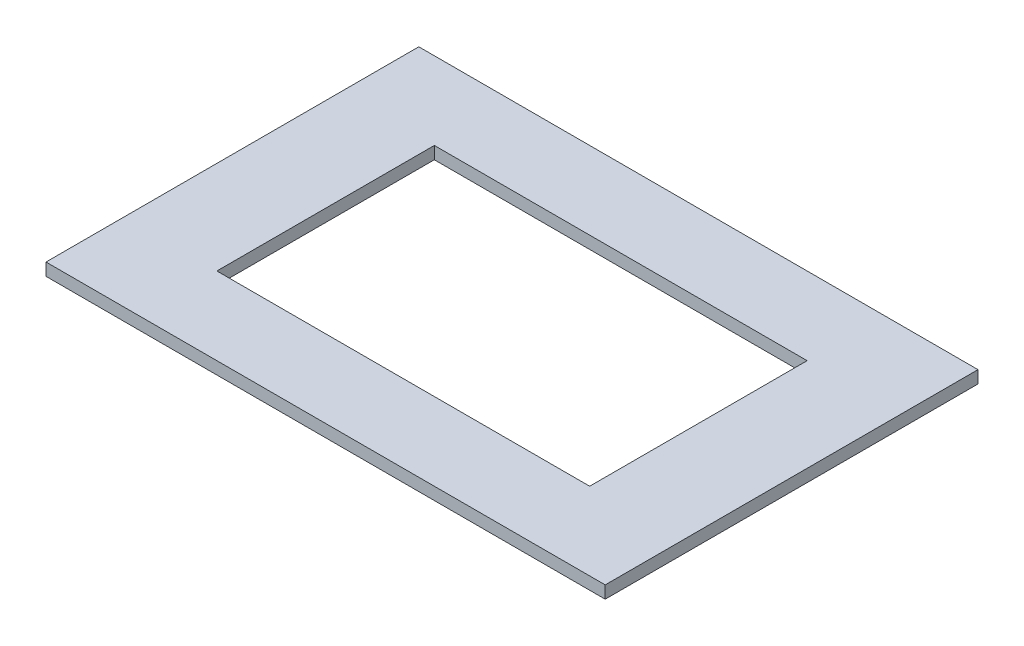
ISO-10303-21;
HEADER;
FILE_DESCRIPTION(('STEP AP214'),'2;1');
FILE_NAME('part.step','',(''),(''),'','','');
FILE_SCHEMA(('AUTOMOTIVE_DESIGN { 1 0 10303 214 1 1 1 1 }'));
ENDSEC;
DATA;
#1=APPLICATION_CONTEXT('core data for automotive mechanical design processes');
#2=APPLICATION_PROTOCOL_DEFINITION('international standard','automotive_design',2000,#1);
#3=PRODUCT_CONTEXT('',#1,'mechanical');
#4=PRODUCT('Part','Part','',(#3));
#5=PRODUCT_RELATED_PRODUCT_CATEGORY('part','',(#4));
#6=PRODUCT_DEFINITION_FORMATION('','',#4);
#7=PRODUCT_DEFINITION_CONTEXT('part definition',#1,'design');
#8=PRODUCT_DEFINITION('design','',#6,#7);
#9=PRODUCT_DEFINITION_SHAPE('','',#8);
#10=(LENGTH_UNIT() NAMED_UNIT(*) SI_UNIT(.MILLI.,.METRE.));
#11=(NAMED_UNIT(*) PLANE_ANGLE_UNIT() SI_UNIT($,.RADIAN.));
#12=(NAMED_UNIT(*) SI_UNIT($,.STERADIAN.) SOLID_ANGLE_UNIT());
#13=UNCERTAINTY_MEASURE_WITH_UNIT(LENGTH_MEASURE(1.E-05),#10,'distance_accuracy_value','');
#14=(GEOMETRIC_REPRESENTATION_CONTEXT(3) GLOBAL_UNCERTAINTY_ASSIGNED_CONTEXT((#13)) GLOBAL_UNIT_ASSIGNED_CONTEXT((#10,
#11,#12)) REPRESENTATION_CONTEXT('',''));
#15=CARTESIAN_POINT('',(0.,0.,0.));
#16=DIRECTION('',(0.,0.,1.));
#17=DIRECTION('',(1.,0.,0.));
#18=AXIS2_PLACEMENT_3D('',#15,#16,#17);
#19=CARTESIAN_POINT('',(0.,6.,0.));
#20=DIRECTION('',(0.,-1.,0.));
#21=DIRECTION('',(0.,0.,-1.));
#22=AXIS2_PLACEMENT_3D('',#19,#20,#21);
#23=PLANE('',#22);
#24=DIRECTION('',(1.,0.,0.));
#25=VECTOR('',#24,1.);
#26=CARTESIAN_POINT('',(270.,6.,0.));
#27=LINE('',#26,#25);
#28=CARTESIAN_POINT('',(0.,6.,0.));
#29=VERTEX_POINT('',#28);
#30=CARTESIAN_POINT('',(270.,6.,0.));
#31=VERTEX_POINT('',#30);
#32=EDGE_CURVE('E134',#29,#31,#27,.T.);
#33=ORIENTED_EDGE('',*,*,#32,.T.);
#34=DIRECTION('',(0.,0.,-1.));
#35=VECTOR('',#34,1.);
#36=CARTESIAN_POINT('',(270.,6.,-180.));
#37=LINE('',#36,#35);
#38=CARTESIAN_POINT('',(270.,6.,-180.));
#39=VERTEX_POINT('',#38);
#40=EDGE_CURVE('E137',#31,#39,#37,.T.);
#41=ORIENTED_EDGE('',*,*,#40,.T.);
#42=DIRECTION('',(-1.,0.,0.));
#43=VECTOR('',#42,1.);
#44=CARTESIAN_POINT('',(0.,6.,-180.));
#45=LINE('',#44,#43);
#46=CARTESIAN_POINT('',(0.,6.,-180.));
#47=VERTEX_POINT('',#46);
#48=EDGE_CURVE('E140',#39,#47,#45,.T.);
#49=ORIENTED_EDGE('',*,*,#48,.T.);
#50=DIRECTION('',(0.,0.,1.));
#51=VECTOR('',#50,1.);
#52=CARTESIAN_POINT('',(0.,6.,0.));
#53=LINE('',#52,#51);
#54=EDGE_CURVE('E142',#47,#29,#53,.T.);
#55=ORIENTED_EDGE('',*,*,#54,.T.);
#56=EDGE_LOOP('',(#33,#41,#49,#55));
#57=FACE_BOUND('',#56,.T.);
#58=DIRECTION('',(-1.,0.,0.));
#59=VECTOR('',#58,1.);
#60=CARTESIAN_POINT('',(225.,6.,-142.5));
#61=LINE('',#60,#59);
#62=CARTESIAN_POINT('',(225.,6.,-142.5));
#63=VERTEX_POINT('',#62);
#64=CARTESIAN_POINT('',(45.0000000000001,6.,-142.5));
#65=VERTEX_POINT('',#64);
#66=EDGE_CURVE('E98',#63,#65,#61,.T.);
#67=ORIENTED_EDGE('',*,*,#66,.F.);
#68=DIRECTION('',(0.,0.,-1.));
#69=VECTOR('',#68,1.);
#70=CARTESIAN_POINT('',(225.,6.,-37.5));
#71=LINE('',#70,#69);
#72=CARTESIAN_POINT('',(225.,6.,-37.5));
#73=VERTEX_POINT('',#72);
#74=EDGE_CURVE('E120',#73,#63,#71,.T.);
#75=ORIENTED_EDGE('',*,*,#74,.F.);
#76=DIRECTION('',(1.,0.,0.));
#77=VECTOR('',#76,1.);
#78=CARTESIAN_POINT('',(45.0000000000001,6.,-37.5));
#79=LINE('',#78,#77);
#80=CARTESIAN_POINT('',(45.0000000000001,6.,-37.5));
#81=VERTEX_POINT('',#80);
#82=EDGE_CURVE('E118',#81,#73,#79,.T.);
#83=ORIENTED_EDGE('',*,*,#82,.F.);
#84=DIRECTION('',(0.,0.,1.));
#85=VECTOR('',#84,1.);
#86=CARTESIAN_POINT('',(45.0000000000001,6.,-142.5));
#87=LINE('',#86,#85);
#88=EDGE_CURVE('E106',#65,#81,#87,.T.);
#89=ORIENTED_EDGE('',*,*,#88,.F.);
#90=EDGE_LOOP('',(#67,#75,#83,#89));
#91=FACE_BOUND('',#90,.T.);
#92=ADVANCED_FACE('F33',(#57,#91),#23,.F.);
#93=CARTESIAN_POINT('',(0.,0.,0.));
#94=DIRECTION('',(0.,-1.,0.));
#95=DIRECTION('',(0.,0.,-1.));
#96=AXIS2_PLACEMENT_3D('',#93,#94,#95);
#97=PLANE('',#96);
#98=DIRECTION('',(1.,0.,0.));
#99=VECTOR('',#98,1.);
#100=CARTESIAN_POINT('',(270.,0.,0.));
#101=LINE('',#100,#99);
#102=CARTESIAN_POINT('',(0.,0.,0.));
#103=VERTEX_POINT('',#102);
#104=CARTESIAN_POINT('',(270.,0.,0.));
#105=VERTEX_POINT('',#104);
#106=EDGE_CURVE('E114',#103,#105,#101,.T.);
#107=ORIENTED_EDGE('',*,*,#106,.F.);
#108=DIRECTION('',(0.,0.,1.));
#109=VECTOR('',#108,1.);
#110=CARTESIAN_POINT('',(0.,0.,0.));
#111=LINE('',#110,#109);
#112=CARTESIAN_POINT('',(0.,0.,-180.));
#113=VERTEX_POINT('',#112);
#114=EDGE_CURVE('E138',#113,#103,#111,.T.);
#115=ORIENTED_EDGE('',*,*,#114,.F.);
#116=DIRECTION('',(-1.,0.,0.));
#117=VECTOR('',#116,1.);
#118=CARTESIAN_POINT('',(0.,0.,-180.));
#119=LINE('',#118,#117);
#120=CARTESIAN_POINT('',(270.,0.,-180.));
#121=VERTEX_POINT('',#120);
#122=EDGE_CURVE('E149',#121,#113,#119,.T.);
#123=ORIENTED_EDGE('',*,*,#122,.F.);
#124=DIRECTION('',(0.,0.,-1.));
#125=VECTOR('',#124,1.);
#126=CARTESIAN_POINT('',(270.,0.,-180.));
#127=LINE('',#126,#125);
#128=EDGE_CURVE('E147',#105,#121,#127,.T.);
#129=ORIENTED_EDGE('',*,*,#128,.F.);
#130=EDGE_LOOP('',(#107,#115,#123,#129));
#131=FACE_BOUND('',#130,.T.);
#132=DIRECTION('',(0.,0.,-1.));
#133=VECTOR('',#132,1.);
#134=CARTESIAN_POINT('',(225.,0.,-37.5));
#135=LINE('',#134,#133);
#136=CARTESIAN_POINT('',(225.,0.,-37.5));
#137=VERTEX_POINT('',#136);
#138=CARTESIAN_POINT('',(225.,0.,-142.5));
#139=VERTEX_POINT('',#138);
#140=EDGE_CURVE('E107',#137,#139,#135,.T.);
#141=ORIENTED_EDGE('',*,*,#140,.T.);
#142=DIRECTION('',(-1.,0.,0.));
#143=VECTOR('',#142,1.);
#144=CARTESIAN_POINT('',(225.,0.,-142.5));
#145=LINE('',#144,#143);
#146=CARTESIAN_POINT('',(45.0000000000001,0.,-142.5));
#147=VERTEX_POINT('',#146);
#148=EDGE_CURVE('E56',#139,#147,#145,.T.);
#149=ORIENTED_EDGE('',*,*,#148,.T.);
#150=DIRECTION('',(0.,0.,1.));
#151=VECTOR('',#150,1.);
#152=CARTESIAN_POINT('',(45.0000000000001,0.,-142.5));
#153=LINE('',#152,#151);
#154=CARTESIAN_POINT('',(45.0000000000001,0.,-37.5));
#155=VERTEX_POINT('',#154);
#156=EDGE_CURVE('E113',#147,#155,#153,.T.);
#157=ORIENTED_EDGE('',*,*,#156,.T.);
#158=DIRECTION('',(1.,0.,0.));
#159=VECTOR('',#158,1.);
#160=CARTESIAN_POINT('',(45.0000000000001,0.,-37.5));
#161=LINE('',#160,#159);
#162=EDGE_CURVE('E126',#155,#137,#161,.T.);
#163=ORIENTED_EDGE('',*,*,#162,.T.);
#164=EDGE_LOOP('',(#141,#149,#157,#163));
#165=FACE_BOUND('',#164,.T.);
#166=ADVANCED_FACE('F167',(#131,#165),#97,.T.);
#167=CARTESIAN_POINT('',(270.,6.,0.));
#168=DIRECTION('',(0.,0.,-1.));
#169=DIRECTION('',(-1.,0.,0.));
#170=AXIS2_PLACEMENT_3D('',#167,#168,#169);
#171=PLANE('',#170);
#172=ORIENTED_EDGE('',*,*,#106,.T.);
#173=DIRECTION('',(0.,-1.,0.));
#174=VECTOR('',#173,1.);
#175=CARTESIAN_POINT('',(270.,6.,0.));
#176=LINE('',#175,#174);
#177=EDGE_CURVE('E11',#31,#105,#176,.T.);
#178=ORIENTED_EDGE('',*,*,#177,.F.);
#179=ORIENTED_EDGE('',*,*,#32,.F.);
#180=DIRECTION('',(0.,-1.,0.));
#181=VECTOR('',#180,1.);
#182=CARTESIAN_POINT('',(0.,6.,0.));
#183=LINE('',#182,#181);
#184=EDGE_CURVE('E144',#29,#103,#183,.T.);
#185=ORIENTED_EDGE('',*,*,#184,.T.);
#186=EDGE_LOOP('',(#172,#178,#179,#185));
#187=FACE_BOUND('',#186,.T.);
#188=ADVANCED_FACE('F35',(#187),#171,.F.);
#189=CARTESIAN_POINT('',(270.,6.,-180.));
#190=DIRECTION('',(-1.,0.,0.));
#191=DIRECTION('',(0.,0.,1.));
#192=AXIS2_PLACEMENT_3D('',#189,#190,#191);
#193=PLANE('',#192);
#194=ORIENTED_EDGE('',*,*,#128,.T.);
#195=DIRECTION('',(0.,-1.,0.));
#196=VECTOR('',#195,1.);
#197=CARTESIAN_POINT('',(270.,6.,-180.));
#198=LINE('',#197,#196);
#199=EDGE_CURVE('E41',#39,#121,#198,.T.);
#200=ORIENTED_EDGE('',*,*,#199,.F.);
#201=ORIENTED_EDGE('',*,*,#40,.F.);
#202=ORIENTED_EDGE('',*,*,#177,.T.);
#203=EDGE_LOOP('',(#194,#200,#201,#202));
#204=FACE_BOUND('',#203,.T.);
#205=ADVANCED_FACE('F177',(#204),#193,.F.);
#206=CARTESIAN_POINT('',(0.,6.,-180.));
#207=DIRECTION('',(0.,0.,1.));
#208=DIRECTION('',(1.,0.,0.));
#209=AXIS2_PLACEMENT_3D('',#206,#207,#208);
#210=PLANE('',#209);
#211=ORIENTED_EDGE('',*,*,#122,.T.);
#212=DIRECTION('',(0.,-1.,0.));
#213=VECTOR('',#212,1.);
#214=CARTESIAN_POINT('',(0.,6.,-180.));
#215=LINE('',#214,#213);
#216=EDGE_CURVE('E154',#47,#113,#215,.T.);
#217=ORIENTED_EDGE('',*,*,#216,.F.);
#218=ORIENTED_EDGE('',*,*,#48,.F.);
#219=ORIENTED_EDGE('',*,*,#199,.T.);
#220=EDGE_LOOP('',(#211,#217,#218,#219));
#221=FACE_BOUND('',#220,.T.);
#222=ADVANCED_FACE('F161',(#221),#210,.F.);
#223=CARTESIAN_POINT('',(0.,6.,0.));
#224=DIRECTION('',(1.,0.,0.));
#225=DIRECTION('',(0.,0.,-1.));
#226=AXIS2_PLACEMENT_3D('',#223,#224,#225);
#227=PLANE('',#226);
#228=ORIENTED_EDGE('',*,*,#114,.T.);
#229=ORIENTED_EDGE('',*,*,#184,.F.);
#230=ORIENTED_EDGE('',*,*,#54,.F.);
#231=ORIENTED_EDGE('',*,*,#216,.T.);
#232=EDGE_LOOP('',(#228,#229,#230,#231));
#233=FACE_BOUND('',#232,.T.);
#234=ADVANCED_FACE('F171',(#233),#227,.F.);
#235=CARTESIAN_POINT('',(225.,6.,-142.5));
#236=DIRECTION('',(0.,0.,1.));
#237=DIRECTION('',(1.,0.,0.));
#238=AXIS2_PLACEMENT_3D('',#235,#236,#237);
#239=PLANE('',#238);
#240=ORIENTED_EDGE('',*,*,#148,.F.);
#241=DIRECTION('',(0.,-1.,0.));
#242=VECTOR('',#241,1.);
#243=CARTESIAN_POINT('',(225.,6.,-142.5));
#244=LINE('',#243,#242);
#245=EDGE_CURVE('E102',#63,#139,#244,.T.);
#246=ORIENTED_EDGE('',*,*,#245,.F.);
#247=ORIENTED_EDGE('',*,*,#66,.T.);
#248=DIRECTION('',(0.,-1.,0.));
#249=VECTOR('',#248,1.);
#250=CARTESIAN_POINT('',(45.0000000000001,6.,-142.5));
#251=LINE('',#250,#249);
#252=EDGE_CURVE('E101',#65,#147,#251,.T.);
#253=ORIENTED_EDGE('',*,*,#252,.T.);
#254=EDGE_LOOP('',(#240,#246,#247,#253));
#255=FACE_BOUND('',#254,.T.);
#256=ADVANCED_FACE('F100',(#255),#239,.T.);
#257=CARTESIAN_POINT('',(45.0000000000001,6.,-142.5));
#258=DIRECTION('',(1.,0.,0.));
#259=DIRECTION('',(0.,0.,-1.));
#260=AXIS2_PLACEMENT_3D('',#257,#258,#259);
#261=PLANE('',#260);
#262=ORIENTED_EDGE('',*,*,#156,.F.);
#263=ORIENTED_EDGE('',*,*,#252,.F.);
#264=ORIENTED_EDGE('',*,*,#88,.T.);
#265=DIRECTION('',(0.,-1.,0.));
#266=VECTOR('',#265,1.);
#267=CARTESIAN_POINT('',(45.0000000000001,6.,-37.5));
#268=LINE('',#267,#266);
#269=EDGE_CURVE('E115',#81,#155,#268,.T.);
#270=ORIENTED_EDGE('',*,*,#269,.T.);
#271=EDGE_LOOP('',(#262,#263,#264,#270));
#272=FACE_BOUND('',#271,.T.);
#273=ADVANCED_FACE('F110',(#272),#261,.T.);
#274=CARTESIAN_POINT('',(45.0000000000001,6.,-37.5));
#275=DIRECTION('',(0.,0.,-1.));
#276=DIRECTION('',(-1.,0.,0.));
#277=AXIS2_PLACEMENT_3D('',#274,#275,#276);
#278=PLANE('',#277);
#279=ORIENTED_EDGE('',*,*,#162,.F.);
#280=ORIENTED_EDGE('',*,*,#269,.F.);
#281=ORIENTED_EDGE('',*,*,#82,.T.);
#282=DIRECTION('',(0.,-1.,0.));
#283=VECTOR('',#282,1.);
#284=CARTESIAN_POINT('',(225.,6.,-37.5));
#285=LINE('',#284,#283);
#286=EDGE_CURVE('E48',#73,#137,#285,.T.);
#287=ORIENTED_EDGE('',*,*,#286,.T.);
#288=EDGE_LOOP('',(#279,#280,#281,#287));
#289=FACE_BOUND('',#288,.T.);
#290=ADVANCED_FACE('F200',(#289),#278,.T.);
#291=CARTESIAN_POINT('',(225.,6.,-37.5));
#292=DIRECTION('',(-1.,0.,0.));
#293=DIRECTION('',(0.,0.,1.));
#294=AXIS2_PLACEMENT_3D('',#291,#292,#293);
#295=PLANE('',#294);
#296=ORIENTED_EDGE('',*,*,#140,.F.);
#297=ORIENTED_EDGE('',*,*,#286,.F.);
#298=ORIENTED_EDGE('',*,*,#74,.T.);
#299=ORIENTED_EDGE('',*,*,#245,.T.);
#300=EDGE_LOOP('',(#296,#297,#298,#299));
#301=FACE_BOUND('',#300,.T.);
#302=ADVANCED_FACE('F204',(#301),#295,.T.);
#303=CLOSED_SHELL('',(#92,#166,#188,#205,#222,#234,#256,#273,#290,#302));
#304=MANIFOLD_SOLID_BREP('B2',#303);
#305=ADVANCED_BREP_SHAPE_REPRESENTATION('',(#18,#304),#14);
#306=SHAPE_DEFINITION_REPRESENTATION(#9,#305);
ENDSEC;
END-ISO-10303-21;
